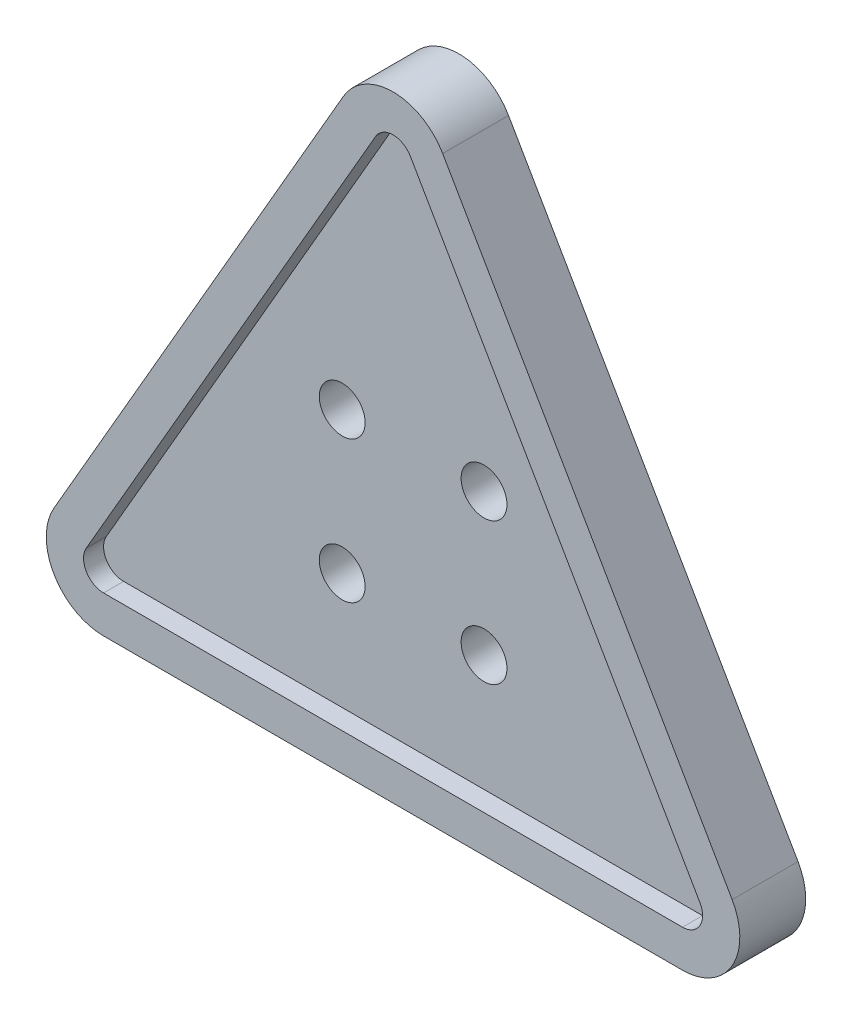
ISO-10303-21;
HEADER;
FILE_DESCRIPTION(('STEP AP214'),'2;1');
FILE_NAME('part.step','',(''),(''),'','','');
FILE_SCHEMA(('AUTOMOTIVE_DESIGN { 1 0 10303 214 1 1 1 1 }'));
ENDSEC;
DATA;
#1=APPLICATION_CONTEXT('core data for automotive mechanical design processes');
#2=APPLICATION_PROTOCOL_DEFINITION('international standard','automotive_design',2000,#1);
#3=PRODUCT_CONTEXT('',#1,'mechanical');
#4=PRODUCT('Part','Part','',(#3));
#5=PRODUCT_RELATED_PRODUCT_CATEGORY('part','',(#4));
#6=PRODUCT_DEFINITION_FORMATION('','',#4);
#7=PRODUCT_DEFINITION_CONTEXT('part definition',#1,'design');
#8=PRODUCT_DEFINITION('design','',#6,#7);
#9=PRODUCT_DEFINITION_SHAPE('','',#8);
#10=(LENGTH_UNIT() NAMED_UNIT(*) SI_UNIT(.MILLI.,.METRE.));
#11=(NAMED_UNIT(*) PLANE_ANGLE_UNIT() SI_UNIT($,.RADIAN.));
#12=(NAMED_UNIT(*) SI_UNIT($,.STERADIAN.) SOLID_ANGLE_UNIT());
#13=UNCERTAINTY_MEASURE_WITH_UNIT(LENGTH_MEASURE(1.E-05),#10,'distance_accuracy_value','');
#14=(GEOMETRIC_REPRESENTATION_CONTEXT(3) GLOBAL_UNCERTAINTY_ASSIGNED_CONTEXT((#13)) GLOBAL_UNIT_ASSIGNED_CONTEXT((#10,
#11,#12)) REPRESENTATION_CONTEXT('',''));
#15=CARTESIAN_POINT('',(0.,0.,0.));
#16=DIRECTION('',(0.,0.,1.));
#17=DIRECTION('',(1.,0.,0.));
#18=AXIS2_PLACEMENT_3D('',#15,#16,#17);
#19=CARTESIAN_POINT('',(-4.94974746830583,4.94974746830583,4.6));
#20=DIRECTION('',(0.,0.,-1.));
#21=DIRECTION('',(-1.,0.,0.));
#22=AXIS2_PLACEMENT_3D('',#19,#20,#21);
#23=CYLINDRICAL_SURFACE('',#22,1.6);
#24=CARTESIAN_POINT('',(-4.94974746830583,4.94974746830583,0.));
#25=DIRECTION('',(0.,0.,1.));
#26=DIRECTION('',(1.,0.,0.));
#27=AXIS2_PLACEMENT_3D('',#24,#25,#26);
#28=CIRCLE('',#27,1.6);
#29=CARTESIAN_POINT('',(-3.34974746830583,4.94974746830583,0.));
#30=VERTEX_POINT('',#29);
#31=EDGE_CURVE('E135',#30,#30,#28,.T.);
#32=ORIENTED_EDGE('',*,*,#31,.F.);
#33=EDGE_LOOP('',(#32));
#34=FACE_BOUND('',#33,.T.);
#35=CARTESIAN_POINT('',(-4.94974746830583,4.94974746830583,3.2));
#36=DIRECTION('',(0.,0.,1.));
#37=DIRECTION('',(1.,0.,0.));
#38=AXIS2_PLACEMENT_3D('',#35,#36,#37);
#39=CIRCLE('',#38,1.6);
#40=CARTESIAN_POINT('',(-3.34974746830583,4.94974746830583,3.2));
#41=VERTEX_POINT('',#40);
#42=EDGE_CURVE('E173',#41,#41,#39,.T.);
#43=ORIENTED_EDGE('',*,*,#42,.T.);
#44=EDGE_LOOP('',(#43));
#45=FACE_BOUND('',#44,.T.);
#46=ADVANCED_FACE('F33',(#34,#45),#23,.F.);
#47=CARTESIAN_POINT('',(4.94974746830583,4.94974746830583,4.6));
#48=DIRECTION('',(0.,0.,-1.));
#49=DIRECTION('',(-1.,0.,0.));
#50=AXIS2_PLACEMENT_3D('',#47,#48,#49);
#51=CYLINDRICAL_SURFACE('',#50,1.6);
#52=CARTESIAN_POINT('',(4.94974746830583,4.94974746830583,0.));
#53=DIRECTION('',(0.,0.,1.));
#54=DIRECTION('',(1.,0.,0.));
#55=AXIS2_PLACEMENT_3D('',#52,#53,#54);
#56=CIRCLE('',#55,1.6);
#57=CARTESIAN_POINT('',(6.54974746830583,4.94974746830583,0.));
#58=VERTEX_POINT('',#57);
#59=EDGE_CURVE('E164',#58,#58,#56,.T.);
#60=ORIENTED_EDGE('',*,*,#59,.F.);
#61=EDGE_LOOP('',(#60));
#62=FACE_BOUND('',#61,.T.);
#63=CARTESIAN_POINT('',(4.94974746830583,4.94974746830583,3.2));
#64=DIRECTION('',(0.,0.,1.));
#65=DIRECTION('',(1.,0.,0.));
#66=AXIS2_PLACEMENT_3D('',#63,#64,#65);
#67=CIRCLE('',#66,1.6);
#68=CARTESIAN_POINT('',(6.54974746830583,4.94974746830583,3.2));
#69=VERTEX_POINT('',#68);
#70=EDGE_CURVE('E176',#69,#69,#67,.T.);
#71=ORIENTED_EDGE('',*,*,#70,.T.);
#72=EDGE_LOOP('',(#71));
#73=FACE_BOUND('',#72,.T.);
#74=ADVANCED_FACE('F288',(#62,#73),#51,.F.);
#75=CARTESIAN_POINT('',(4.94974746830583,-4.94974746830583,4.6));
#76=DIRECTION('',(0.,0.,-1.));
#77=DIRECTION('',(-1.,0.,0.));
#78=AXIS2_PLACEMENT_3D('',#75,#76,#77);
#79=CYLINDRICAL_SURFACE('',#78,1.6);
#80=CARTESIAN_POINT('',(4.94974746830583,-4.94974746830583,0.));
#81=DIRECTION('',(0.,0.,1.));
#82=DIRECTION('',(1.,0.,0.));
#83=AXIS2_PLACEMENT_3D('',#80,#81,#82);
#84=CIRCLE('',#83,1.6);
#85=CARTESIAN_POINT('',(6.54974746830583,-4.94974746830583,0.));
#86=VERTEX_POINT('',#85);
#87=EDGE_CURVE('E167',#86,#86,#84,.T.);
#88=ORIENTED_EDGE('',*,*,#87,.F.);
#89=EDGE_LOOP('',(#88));
#90=FACE_BOUND('',#89,.T.);
#91=CARTESIAN_POINT('',(4.94974746830583,-4.94974746830583,3.2));
#92=DIRECTION('',(0.,0.,1.));
#93=DIRECTION('',(1.,0.,0.));
#94=AXIS2_PLACEMENT_3D('',#91,#92,#93);
#95=CIRCLE('',#94,1.6);
#96=CARTESIAN_POINT('',(6.54974746830583,-4.94974746830583,3.2));
#97=VERTEX_POINT('',#96);
#98=EDGE_CURVE('E179',#97,#97,#95,.T.);
#99=ORIENTED_EDGE('',*,*,#98,.T.);
#100=EDGE_LOOP('',(#99));
#101=FACE_BOUND('',#100,.T.);
#102=ADVANCED_FACE('F294',(#90,#101),#79,.F.);
#103=CARTESIAN_POINT('',(-4.94974746830583,-4.94974746830583,4.6));
#104=DIRECTION('',(0.,0.,-1.));
#105=DIRECTION('',(-1.,0.,0.));
#106=AXIS2_PLACEMENT_3D('',#103,#104,#105);
#107=CYLINDRICAL_SURFACE('',#106,1.6);
#108=CARTESIAN_POINT('',(-4.94974746830583,-4.94974746830583,0.));
#109=DIRECTION('',(0.,0.,1.));
#110=DIRECTION('',(1.,0.,0.));
#111=AXIS2_PLACEMENT_3D('',#108,#109,#110);
#112=CIRCLE('',#111,1.6);
#113=CARTESIAN_POINT('',(-3.34974746830583,-4.94974746830583,0.));
#114=VERTEX_POINT('',#113);
#115=EDGE_CURVE('E170',#114,#114,#112,.T.);
#116=ORIENTED_EDGE('',*,*,#115,.F.);
#117=EDGE_LOOP('',(#116));
#118=FACE_BOUND('',#117,.T.);
#119=CARTESIAN_POINT('',(-4.94974746830583,-4.94974746830583,3.2));
#120=DIRECTION('',(0.,0.,1.));
#121=DIRECTION('',(1.,0.,0.));
#122=AXIS2_PLACEMENT_3D('',#119,#120,#121);
#123=CIRCLE('',#122,1.6);
#124=CARTESIAN_POINT('',(-3.34974746830583,-4.94974746830583,3.2));
#125=VERTEX_POINT('',#124);
#126=EDGE_CURVE('E37',#125,#125,#123,.T.);
#127=ORIENTED_EDGE('',*,*,#126,.T.);
#128=EDGE_LOOP('',(#127));
#129=FACE_BOUND('',#128,.T.);
#130=ADVANCED_FACE('F303',(#118,#129),#107,.F.);
#131=CARTESIAN_POINT('',(-20.2072594216369,-11.6666666666667,4.6));
#132=DIRECTION('',(0.,0.,1.));
#133=DIRECTION('',(1.,0.,0.));
#134=AXIS2_PLACEMENT_3D('',#131,#132,#133);
#135=PLANE('',#134);
#136=CARTESIAN_POINT('',(-20.2072594216369,-11.6666666666667,4.6));
#137=DIRECTION('',(0.,0.,1.));
#138=DIRECTION('',(1.,0.,0.));
#139=AXIS2_PLACEMENT_3D('',#136,#137,#138);
#140=CIRCLE('',#139,1.4);
#141=CARTESIAN_POINT('',(-21.4196949869351,-10.9666666666667,4.6));
#142=VERTEX_POINT('',#141);
#143=CARTESIAN_POINT('',(-20.2072594216369,-13.0666666666667,4.6));
#144=VERTEX_POINT('',#143);
#145=EDGE_CURVE('E49',#142,#144,#140,.T.);
#146=ORIENTED_EDGE('',*,*,#145,.F.);
#147=DIRECTION('',(-0.499999999999999,-0.866025403784439,0.));
#148=VECTOR('',#147,1.);
#149=CARTESIAN_POINT('',(-1.21243556529824,24.0333333333333,4.6));
#150=LINE('',#149,#148);
#151=CARTESIAN_POINT('',(-1.21243556529824,24.0333333333333,4.6));
#152=VERTEX_POINT('',#151);
#153=EDGE_CURVE('E199',#152,#142,#150,.T.);
#154=ORIENTED_EDGE('',*,*,#153,.F.);
#155=CARTESIAN_POINT('',(0.,23.3333333333333,4.6));
#156=DIRECTION('',(0.,0.,1.));
#157=DIRECTION('',(1.,0.,0.));
#158=AXIS2_PLACEMENT_3D('',#155,#156,#157);
#159=CIRCLE('',#158,1.40000000000002);
#160=CARTESIAN_POINT('',(1.21243556529822,24.0333333333333,4.6));
#161=VERTEX_POINT('',#160);
#162=EDGE_CURVE('E203',#161,#152,#159,.T.);
#163=ORIENTED_EDGE('',*,*,#162,.F.);
#164=DIRECTION('',(-0.5,0.866025403784438,0.));
#165=VECTOR('',#164,1.);
#166=CARTESIAN_POINT('',(21.4196949869351,-10.9666666666667,4.6));
#167=LINE('',#166,#165);
#168=CARTESIAN_POINT('',(21.4196949869351,-10.9666666666667,4.6));
#169=VERTEX_POINT('',#168);
#170=EDGE_CURVE('E206',#169,#161,#167,.T.);
#171=ORIENTED_EDGE('',*,*,#170,.F.);
#172=CARTESIAN_POINT('',(20.2072594216369,-11.6666666666667,4.6));
#173=DIRECTION('',(0.,0.,1.));
#174=DIRECTION('',(1.,0.,0.));
#175=AXIS2_PLACEMENT_3D('',#172,#173,#174);
#176=CIRCLE('',#175,1.40000000000001);
#177=CARTESIAN_POINT('',(20.2072594216369,-13.0666666666667,4.6));
#178=VERTEX_POINT('',#177);
#179=EDGE_CURVE('E209',#178,#169,#176,.T.);
#180=ORIENTED_EDGE('',*,*,#179,.F.);
#181=DIRECTION('',(1.,0.,0.));
#182=VECTOR('',#181,1.);
#183=CARTESIAN_POINT('',(-20.2072594216369,-13.0666666666667,4.6));
#184=LINE('',#183,#182);
#185=EDGE_CURVE('E212',#144,#178,#184,.T.);
#186=ORIENTED_EDGE('',*,*,#185,.F.);
#187=EDGE_LOOP('',(#146,#154,#163,#171,#180,#186));
#188=FACE_BOUND('',#187,.T.);
#189=CARTESIAN_POINT('',(-20.2072594216369,-11.6666666666667,4.6));
#190=DIRECTION('',(0.,0.,1.));
#191=DIRECTION('',(1.,0.,0.));
#192=AXIS2_PLACEMENT_3D('',#189,#190,#191);
#193=CIRCLE('',#192,4.);
#194=CARTESIAN_POINT('',(-23.6713610367747,-9.66666666666666,4.6));
#195=VERTEX_POINT('',#194);
#196=CARTESIAN_POINT('',(-20.2072594216369,-15.6666666666667,4.6));
#197=VERTEX_POINT('',#196);
#198=EDGE_CURVE('E143',#195,#197,#193,.T.);
#199=ORIENTED_EDGE('',*,*,#198,.T.);
#200=DIRECTION('',(1.,0.,0.));
#201=VECTOR('',#200,1.);
#202=CARTESIAN_POINT('',(-20.2072594216369,-15.6666666666667,4.6));
#203=LINE('',#202,#201);
#204=CARTESIAN_POINT('',(20.2072594216369,-15.6666666666667,4.6));
#205=VERTEX_POINT('',#204);
#206=EDGE_CURVE('E93',#197,#205,#203,.T.);
#207=ORIENTED_EDGE('',*,*,#206,.T.);
#208=CARTESIAN_POINT('',(20.2072594216369,-11.6666666666667,4.6));
#209=DIRECTION('',(0.,0.,1.));
#210=DIRECTION('',(1.,0.,0.));
#211=AXIS2_PLACEMENT_3D('',#208,#209,#210);
#212=CIRCLE('',#211,4.00000000000002);
#213=CARTESIAN_POINT('',(23.6713610367747,-9.66666666666665,4.6));
#214=VERTEX_POINT('',#213);
#215=EDGE_CURVE('E110',#205,#214,#212,.T.);
#216=ORIENTED_EDGE('',*,*,#215,.T.);
#217=DIRECTION('',(-0.5,0.866025403784439,0.));
#218=VECTOR('',#217,1.);
#219=CARTESIAN_POINT('',(23.6713610367747,-9.66666666666665,4.6));
#220=LINE('',#219,#218);
#221=CARTESIAN_POINT('',(3.46410161513777,25.3333333333333,4.6));
#222=VERTEX_POINT('',#221);
#223=EDGE_CURVE('E103',#214,#222,#220,.T.);
#224=ORIENTED_EDGE('',*,*,#223,.T.);
#225=CARTESIAN_POINT('',(0.,23.3333333333333,4.6));
#226=DIRECTION('',(0.,0.,1.));
#227=DIRECTION('',(-1.,0.,0.));
#228=AXIS2_PLACEMENT_3D('',#225,#226,#227);
#229=CIRCLE('',#228,4.00000000000002);
#230=CARTESIAN_POINT('',(-3.46410161513778,25.3333333333333,4.6));
#231=VERTEX_POINT('',#230);
#232=EDGE_CURVE('E107',#222,#231,#229,.T.);
#233=ORIENTED_EDGE('',*,*,#232,.T.);
#234=DIRECTION('',(-0.5,-0.866025403784439,0.));
#235=VECTOR('',#234,1.);
#236=CARTESIAN_POINT('',(-3.46410161513778,25.3333333333333,4.6));
#237=LINE('',#236,#235);
#238=EDGE_CURVE('E58',#231,#195,#237,.T.);
#239=ORIENTED_EDGE('',*,*,#238,.T.);
#240=EDGE_LOOP('',(#199,#207,#216,#224,#233,#239));
#241=FACE_BOUND('',#240,.T.);
#242=ADVANCED_FACE('F105',(#188,#241),#135,.T.);
#243=CARTESIAN_POINT('',(-20.2072594216369,-11.6666666666667,0.));
#244=DIRECTION('',(0.,0.,1.));
#245=DIRECTION('',(1.,0.,0.));
#246=AXIS2_PLACEMENT_3D('',#243,#244,#245);
#247=PLANE('',#246);
#248=CARTESIAN_POINT('',(-20.2072594216369,-11.6666666666667,0.));
#249=DIRECTION('',(0.,0.,1.));
#250=DIRECTION('',(1.,0.,0.));
#251=AXIS2_PLACEMENT_3D('',#248,#249,#250);
#252=CIRCLE('',#251,4.);
#253=CARTESIAN_POINT('',(-23.6713610367747,-9.66666666666666,0.));
#254=VERTEX_POINT('',#253);
#255=CARTESIAN_POINT('',(-20.2072594216369,-15.6666666666667,0.));
#256=VERTEX_POINT('',#255);
#257=EDGE_CURVE('E131',#254,#256,#252,.T.);
#258=ORIENTED_EDGE('',*,*,#257,.F.);
#259=DIRECTION('',(-0.5,-0.866025403784439,0.));
#260=VECTOR('',#259,1.);
#261=CARTESIAN_POINT('',(-3.46410161513778,25.3333333333333,0.));
#262=LINE('',#261,#260);
#263=CARTESIAN_POINT('',(-3.46410161513778,25.3333333333333,0.));
#264=VERTEX_POINT('',#263);
#265=EDGE_CURVE('E85',#264,#254,#262,.T.);
#266=ORIENTED_EDGE('',*,*,#265,.F.);
#267=CARTESIAN_POINT('',(0.,23.3333333333333,0.));
#268=DIRECTION('',(0.,0.,1.));
#269=DIRECTION('',(-1.,0.,0.));
#270=AXIS2_PLACEMENT_3D('',#267,#268,#269);
#271=CIRCLE('',#270,4.00000000000002);
#272=CARTESIAN_POINT('',(3.46410161513777,25.3333333333333,0.));
#273=VERTEX_POINT('',#272);
#274=EDGE_CURVE('E140',#273,#264,#271,.T.);
#275=ORIENTED_EDGE('',*,*,#274,.F.);
#276=DIRECTION('',(-0.5,0.866025403784439,0.));
#277=VECTOR('',#276,1.);
#278=CARTESIAN_POINT('',(23.6713610367747,-9.66666666666665,0.));
#279=LINE('',#278,#277);
#280=CARTESIAN_POINT('',(23.6713610367747,-9.66666666666665,0.));
#281=VERTEX_POINT('',#280);
#282=EDGE_CURVE('E119',#281,#273,#279,.T.);
#283=ORIENTED_EDGE('',*,*,#282,.F.);
#284=CARTESIAN_POINT('',(20.2072594216369,-11.6666666666667,0.));
#285=DIRECTION('',(0.,0.,1.));
#286=DIRECTION('',(1.,0.,0.));
#287=AXIS2_PLACEMENT_3D('',#284,#285,#286);
#288=CIRCLE('',#287,4.00000000000002);
#289=CARTESIAN_POINT('',(20.2072594216369,-15.6666666666667,0.));
#290=VERTEX_POINT('',#289);
#291=EDGE_CURVE('E137',#290,#281,#288,.T.);
#292=ORIENTED_EDGE('',*,*,#291,.F.);
#293=DIRECTION('',(1.,0.,0.));
#294=VECTOR('',#293,1.);
#295=CARTESIAN_POINT('',(-20.2072594216369,-15.6666666666667,0.));
#296=LINE('',#295,#294);
#297=EDGE_CURVE('E134',#256,#290,#296,.T.);
#298=ORIENTED_EDGE('',*,*,#297,.F.);
#299=EDGE_LOOP('',(#258,#266,#275,#283,#292,#298));
#300=FACE_BOUND('',#299,.T.);
#301=ORIENTED_EDGE('',*,*,#31,.T.);
#302=EDGE_LOOP('',(#301));
#303=FACE_BOUND('',#302,.T.);
#304=ORIENTED_EDGE('',*,*,#59,.T.);
#305=EDGE_LOOP('',(#304));
#306=FACE_BOUND('',#305,.T.);
#307=ORIENTED_EDGE('',*,*,#87,.T.);
#308=EDGE_LOOP('',(#307));
#309=FACE_BOUND('',#308,.T.);
#310=ORIENTED_EDGE('',*,*,#115,.T.);
#311=EDGE_LOOP('',(#310));
#312=FACE_BOUND('',#311,.T.);
#313=ADVANCED_FACE('F153',(#300,#303,#306,#309,#312),#247,.F.);
#314=CARTESIAN_POINT('',(-20.2072594216369,-11.6666666666667,4.6));
#315=DIRECTION('',(0.,0.,-1.));
#316=DIRECTION('',(-1.,0.,0.));
#317=AXIS2_PLACEMENT_3D('',#314,#315,#316);
#318=CYLINDRICAL_SURFACE('',#317,4.);
#319=ORIENTED_EDGE('',*,*,#257,.T.);
#320=DIRECTION('',(0.,0.,-1.));
#321=VECTOR('',#320,1.);
#322=CARTESIAN_POINT('',(-20.2072594216369,-15.6666666666667,4.6));
#323=LINE('',#322,#321);
#324=EDGE_CURVE('E11',#197,#256,#323,.T.);
#325=ORIENTED_EDGE('',*,*,#324,.F.);
#326=ORIENTED_EDGE('',*,*,#198,.F.);
#327=DIRECTION('',(0.,0.,-1.));
#328=VECTOR('',#327,1.);
#329=CARTESIAN_POINT('',(-23.6713610367747,-9.66666666666666,4.6));
#330=LINE('',#329,#328);
#331=EDGE_CURVE('E127',#195,#254,#330,.T.);
#332=ORIENTED_EDGE('',*,*,#331,.T.);
#333=EDGE_LOOP('',(#319,#325,#326,#332));
#334=FACE_BOUND('',#333,.T.);
#335=ADVANCED_FACE('F35',(#334),#318,.T.);
#336=CARTESIAN_POINT('',(-20.2072594216369,-15.6666666666667,4.6));
#337=DIRECTION('',(0.,1.,0.));
#338=DIRECTION('',(-1.,0.,0.));
#339=AXIS2_PLACEMENT_3D('',#336,#337,#338);
#340=PLANE('',#339);
#341=ORIENTED_EDGE('',*,*,#297,.T.);
#342=DIRECTION('',(0.,0.,-1.));
#343=VECTOR('',#342,1.);
#344=CARTESIAN_POINT('',(20.2072594216369,-15.6666666666667,4.6));
#345=LINE('',#344,#343);
#346=EDGE_CURVE('E42',#205,#290,#345,.T.);
#347=ORIENTED_EDGE('',*,*,#346,.F.);
#348=ORIENTED_EDGE('',*,*,#206,.F.);
#349=ORIENTED_EDGE('',*,*,#324,.T.);
#350=EDGE_LOOP('',(#341,#347,#348,#349));
#351=FACE_BOUND('',#350,.T.);
#352=ADVANCED_FACE('F313',(#351),#340,.F.);
#353=CARTESIAN_POINT('',(20.2072594216369,-11.6666666666667,4.6));
#354=DIRECTION('',(0.,0.,-1.));
#355=DIRECTION('',(-1.,0.,0.));
#356=AXIS2_PLACEMENT_3D('',#353,#354,#355);
#357=CYLINDRICAL_SURFACE('',#356,4.00000000000002);
#358=ORIENTED_EDGE('',*,*,#291,.T.);
#359=DIRECTION('',(0.,0.,-1.));
#360=VECTOR('',#359,1.);
#361=CARTESIAN_POINT('',(23.6713610367747,-9.66666666666665,4.6));
#362=LINE('',#361,#360);
#363=EDGE_CURVE('E122',#214,#281,#362,.T.);
#364=ORIENTED_EDGE('',*,*,#363,.F.);
#365=ORIENTED_EDGE('',*,*,#215,.F.);
#366=ORIENTED_EDGE('',*,*,#346,.T.);
#367=EDGE_LOOP('',(#358,#364,#365,#366));
#368=FACE_BOUND('',#367,.T.);
#369=ADVANCED_FACE('F150',(#368),#357,.T.);
#370=CARTESIAN_POINT('',(23.6713610367747,-9.66666666666665,4.6));
#371=DIRECTION('',(-0.866025403784439,-0.5,0.));
#372=DIRECTION('',(0.5,-0.866025403784439,0.));
#373=AXIS2_PLACEMENT_3D('',#370,#371,#372);
#374=PLANE('',#373);
#375=ORIENTED_EDGE('',*,*,#282,.T.);
#376=DIRECTION('',(0.,0.,-1.));
#377=VECTOR('',#376,1.);
#378=CARTESIAN_POINT('',(3.46410161513777,25.3333333333333,4.6));
#379=LINE('',#378,#377);
#380=EDGE_CURVE('E116',#222,#273,#379,.T.);
#381=ORIENTED_EDGE('',*,*,#380,.F.);
#382=ORIENTED_EDGE('',*,*,#223,.F.);
#383=ORIENTED_EDGE('',*,*,#363,.T.);
#384=EDGE_LOOP('',(#375,#381,#382,#383));
#385=FACE_BOUND('',#384,.T.);
#386=ADVANCED_FACE('F117',(#385),#374,.F.);
#387=CARTESIAN_POINT('',(0.,23.3333333333333,4.6));
#388=DIRECTION('',(0.,0.,-1.));
#389=DIRECTION('',(-1.,0.,0.));
#390=AXIS2_PLACEMENT_3D('',#387,#388,#389);
#391=CYLINDRICAL_SURFACE('',#390,4.00000000000002);
#392=ORIENTED_EDGE('',*,*,#274,.T.);
#393=DIRECTION('',(0.,0.,-1.));
#394=VECTOR('',#393,1.);
#395=CARTESIAN_POINT('',(-3.46410161513778,25.3333333333333,4.6));
#396=LINE('',#395,#394);
#397=EDGE_CURVE('E123',#231,#264,#396,.T.);
#398=ORIENTED_EDGE('',*,*,#397,.F.);
#399=ORIENTED_EDGE('',*,*,#232,.F.);
#400=ORIENTED_EDGE('',*,*,#380,.T.);
#401=EDGE_LOOP('',(#392,#398,#399,#400));
#402=FACE_BOUND('',#401,.T.);
#403=ADVANCED_FACE('F125',(#402),#391,.T.);
#404=CARTESIAN_POINT('',(-3.46410161513778,25.3333333333333,4.6));
#405=DIRECTION('',(0.866025403784439,-0.5,0.));
#406=DIRECTION('',(0.5,0.866025403784439,0.));
#407=AXIS2_PLACEMENT_3D('',#404,#405,#406);
#408=PLANE('',#407);
#409=ORIENTED_EDGE('',*,*,#265,.T.);
#410=ORIENTED_EDGE('',*,*,#331,.F.);
#411=ORIENTED_EDGE('',*,*,#238,.F.);
#412=ORIENTED_EDGE('',*,*,#397,.T.);
#413=EDGE_LOOP('',(#409,#410,#411,#412));
#414=FACE_BOUND('',#413,.T.);
#415=ADVANCED_FACE('F155',(#414),#408,.F.);
#416=CARTESIAN_POINT('',(-20.2072594216369,-11.6666666666667,3.2));
#417=DIRECTION('',(0.,0.,1.));
#418=DIRECTION('',(1.,0.,0.));
#419=AXIS2_PLACEMENT_3D('',#416,#417,#418);
#420=CYLINDRICAL_SURFACE('',#419,1.4);
#421=ORIENTED_EDGE('',*,*,#145,.T.);
#422=DIRECTION('',(0.,0.,1.));
#423=VECTOR('',#422,1.);
#424=CARTESIAN_POINT('',(-20.2072594216369,-13.0666666666667,3.2));
#425=LINE('',#424,#423);
#426=CARTESIAN_POINT('',(-20.2072594216369,-13.0666666666667,3.2));
#427=VERTEX_POINT('',#426);
#428=EDGE_CURVE('E182',#427,#144,#425,.T.);
#429=ORIENTED_EDGE('',*,*,#428,.F.);
#430=CARTESIAN_POINT('',(-20.2072594216369,-11.6666666666667,3.2));
#431=DIRECTION('',(0.,0.,1.));
#432=DIRECTION('',(1.,0.,0.));
#433=AXIS2_PLACEMENT_3D('',#430,#431,#432);
#434=CIRCLE('',#433,1.4);
#435=CARTESIAN_POINT('',(-21.4196949869351,-10.9666666666667,3.2));
#436=VERTEX_POINT('',#435);
#437=EDGE_CURVE('E202',#436,#427,#434,.T.);
#438=ORIENTED_EDGE('',*,*,#437,.F.);
#439=DIRECTION('',(0.,0.,1.));
#440=VECTOR('',#439,1.);
#441=CARTESIAN_POINT('',(-21.4196949869351,-10.9666666666667,3.2));
#442=LINE('',#441,#440);
#443=EDGE_CURVE('E197',#436,#142,#442,.T.);
#444=ORIENTED_EDGE('',*,*,#443,.T.);
#445=EDGE_LOOP('',(#421,#429,#438,#444));
#446=FACE_BOUND('',#445,.T.);
#447=ADVANCED_FACE('F239',(#446),#420,.F.);
#448=CARTESIAN_POINT('',(-1.21243556529824,24.0333333333333,3.2));
#449=DIRECTION('',(-0.866025403784439,0.499999999999999,0.));
#450=DIRECTION('',(-0.499999999999999,-0.866025403784439,0.));
#451=AXIS2_PLACEMENT_3D('',#448,#449,#450);
#452=PLANE('',#451);
#453=ORIENTED_EDGE('',*,*,#153,.T.);
#454=ORIENTED_EDGE('',*,*,#443,.F.);
#455=DIRECTION('',(-0.499999999999999,-0.866025403784439,0.));
#456=VECTOR('',#455,1.);
#457=CARTESIAN_POINT('',(-1.21243556529824,24.0333333333333,3.2));
#458=LINE('',#457,#456);
#459=CARTESIAN_POINT('',(-1.21243556529824,24.0333333333333,3.2));
#460=VERTEX_POINT('',#459);
#461=EDGE_CURVE('E185',#460,#436,#458,.T.);
#462=ORIENTED_EDGE('',*,*,#461,.F.);
#463=DIRECTION('',(0.,0.,1.));
#464=VECTOR('',#463,1.);
#465=CARTESIAN_POINT('',(-1.21243556529824,24.0333333333333,3.2));
#466=LINE('',#465,#464);
#467=EDGE_CURVE('E194',#460,#152,#466,.T.);
#468=ORIENTED_EDGE('',*,*,#467,.T.);
#469=EDGE_LOOP('',(#453,#454,#462,#468));
#470=FACE_BOUND('',#469,.T.);
#471=ADVANCED_FACE('F255',(#470),#452,.F.);
#472=CARTESIAN_POINT('',(0.,23.3333333333333,3.2));
#473=DIRECTION('',(0.,0.,1.));
#474=DIRECTION('',(1.,0.,0.));
#475=AXIS2_PLACEMENT_3D('',#472,#473,#474);
#476=CYLINDRICAL_SURFACE('',#475,1.40000000000002);
#477=ORIENTED_EDGE('',*,*,#162,.T.);
#478=ORIENTED_EDGE('',*,*,#467,.F.);
#479=CARTESIAN_POINT('',(0.,23.3333333333333,3.2));
#480=DIRECTION('',(0.,0.,1.));
#481=DIRECTION('',(1.,0.,0.));
#482=AXIS2_PLACEMENT_3D('',#479,#480,#481);
#483=CIRCLE('',#482,1.40000000000002);
#484=CARTESIAN_POINT('',(1.21243556529822,24.0333333333333,3.2));
#485=VERTEX_POINT('',#484);
#486=EDGE_CURVE('E218',#485,#460,#483,.T.);
#487=ORIENTED_EDGE('',*,*,#486,.F.);
#488=DIRECTION('',(0.,0.,1.));
#489=VECTOR('',#488,1.);
#490=CARTESIAN_POINT('',(1.21243556529822,24.0333333333333,3.2));
#491=LINE('',#490,#489);
#492=EDGE_CURVE('E191',#485,#161,#491,.T.);
#493=ORIENTED_EDGE('',*,*,#492,.T.);
#494=EDGE_LOOP('',(#477,#478,#487,#493));
#495=FACE_BOUND('',#494,.T.);
#496=ADVANCED_FACE('F260',(#495),#476,.F.);
#497=CARTESIAN_POINT('',(21.4196949869351,-10.9666666666667,3.2));
#498=DIRECTION('',(0.866025403784438,0.5,0.));
#499=DIRECTION('',(-0.5,0.866025403784438,0.));
#500=AXIS2_PLACEMENT_3D('',#497,#498,#499);
#501=PLANE('',#500);
#502=ORIENTED_EDGE('',*,*,#170,.T.);
#503=ORIENTED_EDGE('',*,*,#492,.F.);
#504=DIRECTION('',(-0.5,0.866025403784438,0.));
#505=VECTOR('',#504,1.);
#506=CARTESIAN_POINT('',(21.4196949869351,-10.9666666666667,3.2));
#507=LINE('',#506,#505);
#508=CARTESIAN_POINT('',(21.4196949869351,-10.9666666666667,3.2));
#509=VERTEX_POINT('',#508);
#510=EDGE_CURVE('E221',#509,#485,#507,.T.);
#511=ORIENTED_EDGE('',*,*,#510,.F.);
#512=DIRECTION('',(0.,0.,1.));
#513=VECTOR('',#512,1.);
#514=CARTESIAN_POINT('',(21.4196949869351,-10.9666666666667,3.2));
#515=LINE('',#514,#513);
#516=EDGE_CURVE('E188',#509,#169,#515,.T.);
#517=ORIENTED_EDGE('',*,*,#516,.T.);
#518=EDGE_LOOP('',(#502,#503,#511,#517));
#519=FACE_BOUND('',#518,.T.);
#520=ADVANCED_FACE('F278',(#519),#501,.F.);
#521=CARTESIAN_POINT('',(20.2072594216369,-11.6666666666667,3.2));
#522=DIRECTION('',(0.,0.,1.));
#523=DIRECTION('',(1.,0.,0.));
#524=AXIS2_PLACEMENT_3D('',#521,#522,#523);
#525=CYLINDRICAL_SURFACE('',#524,1.40000000000001);
#526=ORIENTED_EDGE('',*,*,#179,.T.);
#527=ORIENTED_EDGE('',*,*,#516,.F.);
#528=CARTESIAN_POINT('',(20.2072594216369,-11.6666666666667,3.2));
#529=DIRECTION('',(0.,0.,1.));
#530=DIRECTION('',(1.,0.,0.));
#531=AXIS2_PLACEMENT_3D('',#528,#529,#530);
#532=CIRCLE('',#531,1.40000000000001);
#533=CARTESIAN_POINT('',(20.2072594216369,-13.0666666666667,3.2));
#534=VERTEX_POINT('',#533);
#535=EDGE_CURVE('E224',#534,#509,#532,.T.);
#536=ORIENTED_EDGE('',*,*,#535,.F.);
#537=DIRECTION('',(0.,0.,1.));
#538=VECTOR('',#537,1.);
#539=CARTESIAN_POINT('',(20.2072594216369,-13.0666666666667,3.2));
#540=LINE('',#539,#538);
#541=EDGE_CURVE('E184',#534,#178,#540,.T.);
#542=ORIENTED_EDGE('',*,*,#541,.T.);
#543=EDGE_LOOP('',(#526,#527,#536,#542));
#544=FACE_BOUND('',#543,.T.);
#545=ADVANCED_FACE('F274',(#544),#525,.F.);
#546=CARTESIAN_POINT('',(-20.2072594216369,-13.0666666666667,3.2));
#547=DIRECTION('',(0.,-1.,0.));
#548=DIRECTION('',(1.,0.,0.));
#549=AXIS2_PLACEMENT_3D('',#546,#547,#548);
#550=PLANE('',#549);
#551=ORIENTED_EDGE('',*,*,#185,.T.);
#552=ORIENTED_EDGE('',*,*,#541,.F.);
#553=DIRECTION('',(1.,0.,0.));
#554=VECTOR('',#553,1.);
#555=CARTESIAN_POINT('',(-20.2072594216369,-13.0666666666667,3.2));
#556=LINE('',#555,#554);
#557=EDGE_CURVE('E227',#427,#534,#556,.T.);
#558=ORIENTED_EDGE('',*,*,#557,.F.);
#559=ORIENTED_EDGE('',*,*,#428,.T.);
#560=EDGE_LOOP('',(#551,#552,#558,#559));
#561=FACE_BOUND('',#560,.T.);
#562=ADVANCED_FACE('F268',(#561),#550,.F.);
#563=CARTESIAN_POINT('',(-20.2072594216369,-11.6666666666667,3.2));
#564=DIRECTION('',(0.,0.,1.));
#565=DIRECTION('',(1.,0.,0.));
#566=AXIS2_PLACEMENT_3D('',#563,#564,#565);
#567=PLANE('',#566);
#568=ORIENTED_EDGE('',*,*,#42,.F.);
#569=EDGE_LOOP('',(#568));
#570=FACE_BOUND('',#569,.T.);
#571=ORIENTED_EDGE('',*,*,#70,.F.);
#572=EDGE_LOOP('',(#571));
#573=FACE_BOUND('',#572,.T.);
#574=ORIENTED_EDGE('',*,*,#98,.F.);
#575=EDGE_LOOP('',(#574));
#576=FACE_BOUND('',#575,.T.);
#577=ORIENTED_EDGE('',*,*,#126,.F.);
#578=EDGE_LOOP('',(#577));
#579=FACE_BOUND('',#578,.T.);
#580=ORIENTED_EDGE('',*,*,#437,.T.);
#581=ORIENTED_EDGE('',*,*,#557,.T.);
#582=ORIENTED_EDGE('',*,*,#535,.T.);
#583=ORIENTED_EDGE('',*,*,#510,.T.);
#584=ORIENTED_EDGE('',*,*,#486,.T.);
#585=ORIENTED_EDGE('',*,*,#461,.T.);
#586=EDGE_LOOP('',(#580,#581,#582,#583,#584,#585));
#587=FACE_BOUND('',#586,.T.);
#588=ADVANCED_FACE('F234',(#570,#573,#576,#579,#587),#567,.T.);
#589=CLOSED_SHELL('',(#46,#74,#102,#130,#242,#313,#335,#352,#369,#386,#403,#415,#447,#471,#496,
#520,#545,#562,#588));
#590=MANIFOLD_SOLID_BREP('B2',#589);
#591=ADVANCED_BREP_SHAPE_REPRESENTATION('',(#18,#590),#14);
#592=SHAPE_DEFINITION_REPRESENTATION(#9,#591);
ENDSEC;
END-ISO-10303-21;
